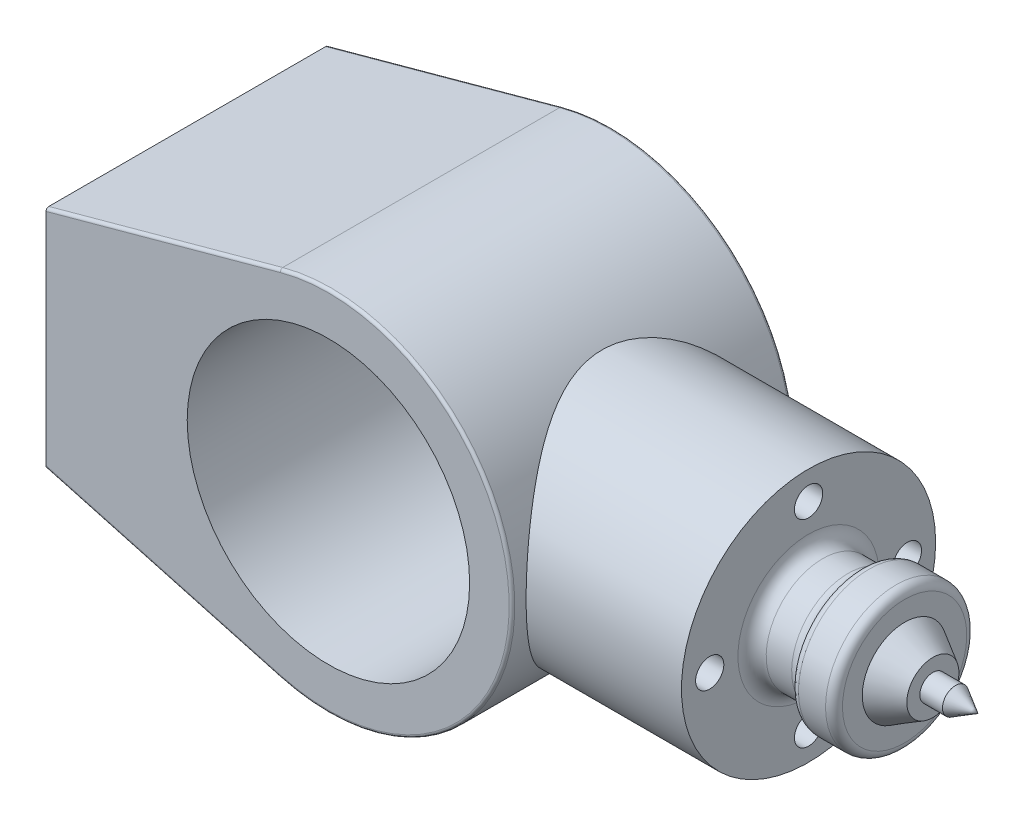
ISO-10303-21;
HEADER;
FILE_DESCRIPTION(('STEP AP214'),'2;1');
FILE_NAME('part.step','',(''),(''),'','','');
FILE_SCHEMA(('AUTOMOTIVE_DESIGN { 1 0 10303 214 1 1 1 1 }'));
ENDSEC;
DATA;
#1=APPLICATION_CONTEXT('core data for automotive mechanical design processes');
#2=APPLICATION_PROTOCOL_DEFINITION('international standard','automotive_design',2000,#1);
#3=PRODUCT_CONTEXT('',#1,'mechanical');
#4=PRODUCT('Part','Part','',(#3));
#5=PRODUCT_RELATED_PRODUCT_CATEGORY('part','',(#4));
#6=PRODUCT_DEFINITION_FORMATION('','',#4);
#7=PRODUCT_DEFINITION_CONTEXT('part definition',#1,'design');
#8=PRODUCT_DEFINITION('design','',#6,#7);
#9=PRODUCT_DEFINITION_SHAPE('','',#8);
#10=(LENGTH_UNIT() NAMED_UNIT(*) SI_UNIT(.MILLI.,.METRE.));
#11=(NAMED_UNIT(*) PLANE_ANGLE_UNIT() SI_UNIT($,.RADIAN.));
#12=(NAMED_UNIT(*) SI_UNIT($,.STERADIAN.) SOLID_ANGLE_UNIT());
#13=UNCERTAINTY_MEASURE_WITH_UNIT(LENGTH_MEASURE(1.E-05),#10,'distance_accuracy_value','');
#14=(GEOMETRIC_REPRESENTATION_CONTEXT(3) GLOBAL_UNCERTAINTY_ASSIGNED_CONTEXT((#13)) GLOBAL_UNIT_ASSIGNED_CONTEXT((#10,
#11,#12)) REPRESENTATION_CONTEXT('',''));
#15=CARTESIAN_POINT('',(0.,0.,0.));
#16=DIRECTION('',(0.,0.,1.));
#17=DIRECTION('',(1.,0.,0.));
#18=AXIS2_PLACEMENT_3D('',#15,#16,#17);
#19=CARTESIAN_POINT('',(0.,0.,50.));
#20=DIRECTION('',(0.,0.,1.));
#21=DIRECTION('',(1.,0.,0.));
#22=AXIS2_PLACEMENT_3D('',#19,#20,#21);
#23=PLANE('',#22);
#24=DIRECTION('',(0.,-1.,0.));
#25=VECTOR('',#24,1.);
#26=CARTESIAN_POINT('',(-100.,-40.,50.));
#27=LINE('',#26,#25);
#28=CARTESIAN_POINT('',(-100.,38.9631546288037,50.));
#29=VERTEX_POINT('',#28);
#30=CARTESIAN_POINT('',(-100.,-38.9631546288037,50.));
#31=VERTEX_POINT('',#30);
#32=EDGE_CURVE('E350',#29,#31,#27,.T.);
#33=ORIENTED_EDGE('',*,*,#32,.T.);
#34=DIRECTION('',(0.964463967125762,-0.264214413149695,0.));
#35=VECTOR('',#34,1.);
#36=CARTESIAN_POINT('',(-16.9097224415805,-61.7256938960487,50.));
#37=LINE('',#36,#35);
#38=CARTESIAN_POINT('',(-16.9097224415805,-61.7256938960487,50.));
#39=VERTEX_POINT('',#38);
#40=EDGE_CURVE('E422',#31,#39,#37,.T.);
#41=ORIENTED_EDGE('',*,*,#40,.T.);
#42=CARTESIAN_POINT('',(0.,0.,50.));
#43=DIRECTION('',(0.,0.,1.));
#44=DIRECTION('',(1.,0.,0.));
#45=AXIS2_PLACEMENT_3D('',#42,#43,#44);
#46=CIRCLE('',#45,64.);
#47=CARTESIAN_POINT('',(-16.9097224415805,61.7256938960487,50.));
#48=VERTEX_POINT('',#47);
#49=EDGE_CURVE('E69',#39,#48,#46,.T.);
#50=ORIENTED_EDGE('',*,*,#49,.T.);
#51=DIRECTION('',(-0.964463967125762,-0.264214413149695,0.));
#52=VECTOR('',#51,1.);
#53=CARTESIAN_POINT('',(-99.7357855868503,39.0355360328742,50.));
#54=LINE('',#53,#52);
#55=EDGE_CURVE('E417',#48,#29,#54,.T.);
#56=ORIENTED_EDGE('',*,*,#55,.T.);
#57=EDGE_LOOP('',(#33,#41,#50,#56));
#58=FACE_BOUND('',#57,.T.);
#59=CARTESIAN_POINT('',(0.,0.,50.));
#60=DIRECTION('',(0.,0.,1.));
#61=DIRECTION('',(1.,0.,0.));
#62=AXIS2_PLACEMENT_3D('',#59,#60,#61);
#63=CIRCLE('',#62,50.);
#64=CARTESIAN_POINT('',(50.,0.,50.));
#65=VERTEX_POINT('',#64);
#66=EDGE_CURVE('E342',#65,#65,#63,.T.);
#67=ORIENTED_EDGE('',*,*,#66,.F.);
#68=EDGE_LOOP('',(#67));
#69=FACE_BOUND('',#68,.T.);
#70=ADVANCED_FACE('F46',(#58,#69),#23,.T.);
#71=CARTESIAN_POINT('',(0.,0.,-50.));
#72=DIRECTION('',(0.,0.,1.));
#73=DIRECTION('',(1.,0.,0.));
#74=AXIS2_PLACEMENT_3D('',#71,#72,#73);
#75=PLANE('',#74);
#76=CARTESIAN_POINT('',(0.,0.,-50.));
#77=DIRECTION('',(0.,0.,1.));
#78=DIRECTION('',(1.,0.,0.));
#79=AXIS2_PLACEMENT_3D('',#76,#77,#78);
#80=CIRCLE('',#79,64.);
#81=CARTESIAN_POINT('',(-16.9097224415805,61.7256938960487,-50.));
#82=VERTEX_POINT('',#81);
#83=CARTESIAN_POINT('',(-16.9097224415805,-61.7256938960487,-50.));
#84=VERTEX_POINT('',#83);
#85=EDGE_CURVE('E393',#82,#84,#80,.F.);
#86=ORIENTED_EDGE('',*,*,#85,.T.);
#87=DIRECTION('',(0.964463967125762,-0.264214413149695,0.));
#88=VECTOR('',#87,1.);
#89=CARTESIAN_POINT('',(-16.9097224415805,-61.7256938960487,-50.));
#90=LINE('',#89,#88);
#91=CARTESIAN_POINT('',(-100.,-38.9631546288037,-50.));
#92=VERTEX_POINT('',#91);
#93=EDGE_CURVE('E396',#84,#92,#90,.F.);
#94=ORIENTED_EDGE('',*,*,#93,.T.);
#95=DIRECTION('',(0.,-1.,0.));
#96=VECTOR('',#95,1.);
#97=CARTESIAN_POINT('',(-100.,-40.,-50.));
#98=LINE('',#97,#96);
#99=CARTESIAN_POINT('',(-100.,38.9631546288037,-50.));
#100=VERTEX_POINT('',#99);
#101=EDGE_CURVE('E348',#100,#92,#98,.T.);
#102=ORIENTED_EDGE('',*,*,#101,.F.);
#103=DIRECTION('',(-0.964463967125762,-0.264214413149695,0.));
#104=VECTOR('',#103,1.);
#105=CARTESIAN_POINT('',(-16.9097224415805,61.7256938960487,-50.));
#106=LINE('',#105,#104);
#107=EDGE_CURVE('E390',#100,#82,#106,.F.);
#108=ORIENTED_EDGE('',*,*,#107,.T.);
#109=EDGE_LOOP('',(#86,#94,#102,#108));
#110=FACE_BOUND('',#109,.T.);
#111=CARTESIAN_POINT('',(0.,0.,-50.));
#112=DIRECTION('',(0.,0.,1.));
#113=DIRECTION('',(1.,0.,0.));
#114=AXIS2_PLACEMENT_3D('',#111,#112,#113);
#115=CIRCLE('',#114,50.);
#116=CARTESIAN_POINT('',(50.,0.,-50.));
#117=VERTEX_POINT('',#116);
#118=EDGE_CURVE('E339',#117,#117,#115,.T.);
#119=ORIENTED_EDGE('',*,*,#118,.T.);
#120=EDGE_LOOP('',(#119));
#121=FACE_BOUND('',#120,.T.);
#122=ADVANCED_FACE('F164',(#110,#121),#75,.F.);
#123=CARTESIAN_POINT('',(-100.,-40.,50.));
#124=DIRECTION('',(0.264214413149695,0.964463967125762,0.));
#125=DIRECTION('',(-0.964463967125762,0.264214413149695,0.));
#126=AXIS2_PLACEMENT_3D('',#123,#124,#125);
#127=PLANE('',#126);
#128=DIRECTION('',(0.,0.,-1.));
#129=VECTOR('',#128,1.);
#130=CARTESIAN_POINT('',(-100.,-40.,50.));
#131=LINE('',#130,#129);
#132=CARTESIAN_POINT('',(-100.,-40.,49.));
#133=VERTEX_POINT('',#132);
#134=CARTESIAN_POINT('',(-100.,-40.,-49.));
#135=VERTEX_POINT('',#134);
#136=EDGE_CURVE('E353',#133,#135,#131,.T.);
#137=ORIENTED_EDGE('',*,*,#136,.T.);
#138=DIRECTION('',(0.964463967125762,-0.264214413149695,0.));
#139=VECTOR('',#138,1.);
#140=CARTESIAN_POINT('',(-100.,-40.,-49.));
#141=LINE('',#140,#139);
#142=CARTESIAN_POINT('',(-17.1739368547302,-62.6901578631745,-49.));
#143=VERTEX_POINT('',#142);
#144=EDGE_CURVE('E386',#135,#143,#141,.T.);
#145=ORIENTED_EDGE('',*,*,#144,.T.);
#146=DIRECTION('',(0.,0.,-1.));
#147=VECTOR('',#146,1.);
#148=CARTESIAN_POINT('',(-17.1739368547302,-62.6901578631745,50.));
#149=LINE('',#148,#147);
#150=CARTESIAN_POINT('',(-17.1739368547302,-62.6901578631745,49.));
#151=VERTEX_POINT('',#150);
#152=EDGE_CURVE('E368',#151,#143,#149,.T.);
#153=ORIENTED_EDGE('',*,*,#152,.F.);
#154=DIRECTION('',(0.964463967125762,-0.264214413149695,0.));
#155=VECTOR('',#154,1.);
#156=CARTESIAN_POINT('',(-100.,-40.,49.));
#157=LINE('',#156,#155);
#158=EDGE_CURVE('E383',#151,#133,#157,.F.);
#159=ORIENTED_EDGE('',*,*,#158,.T.);
#160=EDGE_LOOP('',(#137,#145,#153,#159));
#161=FACE_BOUND('',#160,.T.);
#162=ADVANCED_FACE('F169',(#161),#127,.F.);
#163=CARTESIAN_POINT('',(0.,0.,50.));
#164=DIRECTION('',(0.,0.,-1.));
#165=DIRECTION('',(-1.,0.,0.));
#166=AXIS2_PLACEMENT_3D('',#163,#164,#165);
#167=CYLINDRICAL_SURFACE('',#166,65.);
#168=CARTESIAN_POINT('',(65.,0.,-45.));
#169=CARTESIAN_POINT('',(65.0000011696056,1.12147330120565,-45.0000012025283));
#170=CARTESIAN_POINT('',(64.9709159765212,2.24292945230778,-44.9580201602482));
#171=CARTESIAN_POINT('',(64.8553068641382,4.47658414079082,-44.790785609369));
#172=CARTESIAN_POINT('',(64.7687842573088,5.58878288911931,-44.6655340035371));
#173=CARTESIAN_POINT('',(64.5403785763001,7.79555151848628,-44.3336771879691));
#174=CARTESIAN_POINT('',(64.3984760503455,8.89011506447751,-44.1270433931238));
#175=CARTESIAN_POINT('',(64.0626457436965,11.0533096019768,-43.6354760134034));
#176=CARTESIAN_POINT('',(63.8687169569864,12.1219400915896,-43.3505409144375));
#177=CARTESIAN_POINT('',(63.4342222744662,14.2212125160505,-42.7078017297046));
#178=CARTESIAN_POINT('',(63.1938918545644,15.2520162370063,-42.3503651251477));
#179=CARTESIAN_POINT('',(62.6709259446923,17.2756280115286,-41.5659763086892));
#180=CARTESIAN_POINT('',(62.3882907364914,18.268436318107,-41.1390245597888));
#181=CARTESIAN_POINT('',(61.786108553932,20.2116697228795,-40.2199419970838));
#182=CARTESIAN_POINT('',(61.4665619062631,21.1620951960855,-39.7278117601444));
#183=CARTESIAN_POINT('',(60.7962171584065,23.0172309124315,-38.6825647509799));
#184=CARTESIAN_POINT('',(60.4454175300333,23.9219389167185,-38.1294449962195));
#185=CARTESIAN_POINT('',(59.6865648974473,25.7601880140228,-36.9151737617935));
#186=CARTESIAN_POINT('',(59.2761881540199,26.6893215363404,-36.2488040005491));
#187=CARTESIAN_POINT('',(58.4330275057249,28.4880338622967,-34.8529502059224));
#188=CARTESIAN_POINT('',(58.0002425478181,29.3576098626539,-34.1234632053608));
#189=CARTESIAN_POINT('',(57.1195111836477,31.0364486388513,-32.6040251352403));
#190=CARTESIAN_POINT('',(56.671544718189,31.8456267033451,-31.8139921794123));
#191=CARTESIAN_POINT('',(55.7691986061138,33.4006700551814,-30.1773036556993));
#192=CARTESIAN_POINT('',(55.3148185876118,34.1465316534289,-29.3306447936721));
#193=CARTESIAN_POINT('',(54.3303114345594,35.6959084068904,-27.4326466159468));
#194=CARTESIAN_POINT('',(53.8005937511268,36.4872853280241,-26.3711450656526));
#195=CARTESIAN_POINT('',(52.7593327891933,37.9773509509911,-24.17604025639));
#196=CARTESIAN_POINT('',(52.2477941160226,38.6760162868262,-23.0424189272517));
#197=CARTESIAN_POINT('',(51.2608149265043,39.9749077721744,-20.7072341856928));
#198=CARTESIAN_POINT('',(50.7853275075272,40.5752630453964,-19.5057627267967));
#199=CARTESIAN_POINT('',(49.8892399163792,41.6721166930025,-17.036931864064));
#200=CARTESIAN_POINT('',(49.4686114171658,42.1686687478853,-15.7696069409943));
#201=CARTESIAN_POINT('',(48.8208029416878,42.9149535309565,-13.5723996352816));
#202=CARTESIAN_POINT('',(48.5738420263557,43.1936925213245,-12.6581208440976));
#203=CARTESIAN_POINT('',(48.1238801744123,43.6944569649788,-10.8035389223551));
#204=CARTESIAN_POINT('',(47.9208721021929,43.9164916250901,-9.86324004407419));
#205=CARTESIAN_POINT('',(47.5660754926547,44.3005296261305,-7.96250438663409));
#206=CARTESIAN_POINT('',(47.4142038087044,44.4626304606427,-7.00210302149487));
#207=CARTESIAN_POINT('',(47.1671263845176,44.7246555122386,-5.06554052628518));
#208=CARTESIAN_POINT('',(47.0719206259529,44.824579749433,-4.08937940131225));
#209=CARTESIAN_POINT('',(46.9418899090943,44.9607388198673,-2.12323648479672));
#210=CARTESIAN_POINT('',(46.9073939345416,44.9966266570423,-1.1332085184466));
#211=CARTESIAN_POINT('',(46.9013571135476,45.0029190462422,0.847248377093819));
#212=CARTESIAN_POINT('',(46.9298161498631,44.9733237202183,1.83767730553397));
#213=CARTESIAN_POINT('',(47.048430284982,44.8492190899201,3.81128752429078));
#214=CARTESIAN_POINT('',(47.13862305521,44.7546701492421,4.79446401850659));
#215=CARTESIAN_POINT('',(47.3768313176078,44.5024241630868,6.74551496467453));
#216=CARTESIAN_POINT('',(47.5248480621437,44.3447257499009,7.71338908473165));
#217=CARTESIAN_POINT('',(47.862176427184,43.9803320764262,9.56919366964681));
#218=CARTESIAN_POINT('',(48.0484149088863,43.7772163066585,10.4583970625519));
#219=CARTESIAN_POINT('',(48.4609441046405,43.32010640119,12.2144143492181));
#220=CARTESIAN_POINT('',(48.6872496045114,43.0660934784815,13.0812198417582));
#221=CARTESIAN_POINT('',(49.1738509640382,42.5096331932465,14.7898225666926));
#222=CARTESIAN_POINT('',(49.4341648638833,42.2071601049959,15.6316062329481));
#223=CARTESIAN_POINT('',(49.9825182796334,41.5563350032135,17.2876417419012));
#224=CARTESIAN_POINT('',(50.2705534011696,41.2079902580444,18.1018979206948));
#225=CARTESIAN_POINT('',(51.0225431471344,40.2767822129268,20.1137766396802));
#226=CARTESIAN_POINT('',(51.5007434523328,39.6654891440573,21.2930273345177));
#227=CARTESIAN_POINT('',(52.4891158781476,38.3480299208521,23.5833678403921));
#228=CARTESIAN_POINT('',(52.9993005340588,37.6418264436727,24.6944305853524));
#229=CARTESIAN_POINT('',(54.0361557973493,36.1376496350166,26.8476775780094));
#230=CARTESIAN_POINT('',(54.562853578546,35.339518562356,27.889738450571));
#231=CARTESIAN_POINT('',(55.6171804467177,33.6558443419671,29.8998791095632));
#232=CARTESIAN_POINT('',(56.1448094104417,32.7703120184234,30.8679680307498));
#233=CARTESIAN_POINT('',(57.1932449701134,30.9045304086319,32.7363921475658));
#234=CARTESIAN_POINT('',(57.7139191350982,29.9233731295192,33.6358963165067));
#235=CARTESIAN_POINT('',(58.7296419536464,27.8771206485979,35.350355349792));
#236=CARTESIAN_POINT('',(59.224688270066,26.8120178135979,36.1653025097018));
#237=CARTESIAN_POINT('',(60.1756566955638,24.6035209522421,37.7024332048813));
#238=CARTESIAN_POINT('',(60.6316475651595,23.4602711709794,38.4247809320632));
#239=CARTESIAN_POINT('',(61.493189160821,21.0989507187335,39.7703323765769));
#240=CARTESIAN_POINT('',(61.8987550178729,19.8809026570889,40.3935658507715));
#241=CARTESIAN_POINT('',(62.5646802947782,17.6549035875763,41.4059204565395));
#242=CARTESIAN_POINT('',(62.8372982548466,16.6602403417734,41.8163120535009));
#243=CARTESIAN_POINT('',(63.3397164077327,14.6345031625145,42.5675669112335));
#244=CARTESIAN_POINT('',(63.569522535998,13.603434299959,42.9084398107234));
#245=CARTESIAN_POINT('',(63.9815049902596,11.5110112910017,43.5164676119118));
#246=CARTESIAN_POINT('',(64.1637052650743,10.4496726714622,43.7836595836378));
#247=CARTESIAN_POINT('',(64.476639865795,8.30296993183375,44.2409869387356));
#248=CARTESIAN_POINT('',(64.6073730982256,7.21760530180257,44.431120684921));
#249=CARTESIAN_POINT('',(64.8147345736682,5.02649787175026,44.7321113931982));
#250=CARTESIAN_POINT('',(64.8911534961693,3.92069290489765,44.8426616714377));
#251=CARTESIAN_POINT('',(64.9872183357685,1.70145350776209,44.981563734156));
#252=CARTESIAN_POINT('',(65.0068642771873,0.588019080747705,45.0099155538474));
#253=CARTESIAN_POINT('',(64.9889001241944,-1.63741781931564,44.9839662509349));
#254=CARTESIAN_POINT('',(64.9512898349751,-2.74942028747965,44.929664847113));
#255=CARTESIAN_POINT('',(64.8197344180529,-4.962989473676,44.7392747901952));
#256=CARTESIAN_POINT('',(64.7257910494465,-6.06455651648124,44.6031886909653));
#257=CARTESIAN_POINT('',(64.4911757033089,-8.18254449212146,44.2620157992034));
#258=CARTESIAN_POINT('',(64.3536808680178,-9.20007959997771,44.0616107864454));
#259=CARTESIAN_POINT('',(64.0337856060907,-11.2121337136588,43.593061351668));
#260=CARTESIAN_POINT('',(63.8513873855499,-12.2066538475799,43.3249202574929));
#261=CARTESIAN_POINT('',(63.4451725249075,-14.1673074608522,42.7239854011605));
#262=CARTESIAN_POINT('',(63.2213525684631,-15.1334386601222,42.3911864622048));
#263=CARTESIAN_POINT('',(62.736336352677,-17.0327019487273,41.6643868113869));
#264=CARTESIAN_POINT('',(62.4751380044848,-17.965832190203,41.2703826790343));
#265=CARTESIAN_POINT('',(61.8990085085122,-19.8637431772395,40.3931275129008));
#266=CARTESIAN_POINT('',(61.58152095285,-20.8256806929253,39.9054081529014));
#267=CARTESIAN_POINT('',(60.9142086391395,-22.7035764997345,38.8677076181211));
#268=CARTESIAN_POINT('',(60.5643826081083,-23.6195329786528,38.3177239921568));
#269=CARTESIAN_POINT('',(59.83813471294,-25.4032558353403,37.1592008079418));
#270=CARTESIAN_POINT('',(59.4616987975441,-26.270996314329,36.5506302507532));
#271=CARTESIAN_POINT('',(58.6884577670335,-27.9557544991496,35.2787474176625));
#272=CARTESIAN_POINT('',(58.2916515549571,-28.7727694681138,34.615432192531));
#273=CARTESIAN_POINT('',(57.4151711853793,-30.4889708749911,33.1199200847162));
#274=CARTESIAN_POINT('',(56.9328754552547,-31.3785212006928,32.2781812569548));
#275=CARTESIAN_POINT('',(55.9590893109093,-33.0839042215169,30.527835244559));
#276=CARTESIAN_POINT('',(55.4675975421249,-33.8997259516807,29.61921815009));
#277=CARTESIAN_POINT('',(54.4860350387396,-35.45586994741,27.7375714933993));
#278=CARTESIAN_POINT('',(53.9959654596117,-36.1961418986443,26.7644997080007));
#279=CARTESIAN_POINT('',(53.0294834997435,-37.5978502361011,24.7568233036382));
#280=CARTESIAN_POINT('',(52.553069328415,-38.2592969946585,23.7222268074148));
#281=CARTESIAN_POINT('',(51.679941347726,-39.4291013564639,21.7149007388747));
#282=CARTESIAN_POINT('',(51.2803372484815,-39.9463152685162,20.7485884228094));
#283=CARTESIAN_POINT('',(50.5123974548911,-40.9130636661729,18.7705314851885));
#284=CARTESIAN_POINT('',(50.1440619804653,-41.3625976757848,17.7587865441704));
#285=CARTESIAN_POINT('',(49.4504928922364,-42.1893301292689,15.693797265063));
#286=CARTESIAN_POINT('',(49.1251906412472,-42.566644202947,14.6406225749502));
#287=CARTESIAN_POINT('',(48.5290098021011,-43.2451098617227,12.4950157035289));
#288=CARTESIAN_POINT('',(48.2581179989952,-43.5462799449171,11.4025931307278));
#289=CARTESIAN_POINT('',(47.8271610412375,-44.018687486118,9.39216299943513));
#290=CARTESIAN_POINT('',(47.6558419905218,-44.2036946073207,8.47979353570421));
#291=CARTESIAN_POINT('',(47.3627606953031,-44.517583244497,6.63757582668248));
#292=CARTESIAN_POINT('',(47.2409923142223,-44.6464717105955,5.70772976070377));
#293=CARTESIAN_POINT('',(47.0516661570499,-44.8459556683364,3.83718735816975));
#294=CARTESIAN_POINT('',(46.9840561376508,-44.9166073394188,2.89650236820518));
#295=CARTESIAN_POINT('',(46.9055698265681,-44.9985645522097,1.01014116515039));
#296=CARTESIAN_POINT('',(46.894694331428,-45.0098692606967,0.064464882169828));
#297=CARTESIAN_POINT('',(46.9301408777118,-44.972908524549,-1.82506201386801));
#298=CARTESIAN_POINT('',(46.9764888551695,-44.9246160680299,-2.76891160474199));
#299=CARTESIAN_POINT('',(47.1245232303033,-44.7693052695385,-4.6473189128986));
#300=CARTESIAN_POINT('',(47.2262092962439,-44.6622872796082,-5.58187668584872));
#301=CARTESIAN_POINT('',(47.4811423262628,-44.3911660407895,-7.43666598606559));
#302=CARTESIAN_POINT('',(47.6344529193939,-44.2269923369625,-8.35687836049677));
#303=CARTESIAN_POINT('',(47.9871889035597,-43.8440109221367,-10.1768310643422));
#304=CARTESIAN_POINT('',(48.1866204648688,-43.6251959006593,-11.0765686368372));
#305=CARTESIAN_POINT('',(48.6908782922366,-43.0625185245671,-13.1167261780629));
#306=CARTESIAN_POINT('',(49.0093972350599,-42.7008255731353,-14.2488681052182));
#307=CARTESIAN_POINT('',(49.6995544941609,-41.8955268796886,-16.4668795226372));
#308=CARTESIAN_POINT('',(50.0712093704162,-41.4518955887103,-17.5527344499461));
#309=CARTESIAN_POINT('',(50.8544123719762,-40.4872212981013,-19.6760329984318));
#310=CARTESIAN_POINT('',(51.2660067549032,-39.9660881554129,-20.7134183727637));
#311=CARTESIAN_POINT('',(52.1162118793059,-38.8508952329156,-22.7363587217864));
#312=CARTESIAN_POINT('',(52.5548209260534,-38.2568400254561,-23.7219169406071));
#313=CARTESIAN_POINT('',(53.4579357785501,-36.9847423381264,-25.6613286822633));
#314=CARTESIAN_POINT('',(53.922802110137,-36.3051118639051,-26.6139712103077));
#315=CARTESIAN_POINT('',(54.8583333343945,-34.8753950985048,-28.461753284073));
#316=CARTESIAN_POINT('',(55.3289982185487,-34.1253089107937,-29.3568929142367));
#317=CARTESIAN_POINT('',(56.2664339133502,-32.5564691651912,-31.0876310121466));
#318=CARTESIAN_POINT('',(56.7332035093429,-31.7376950080829,-31.923211478402));
#319=CARTESIAN_POINT('',(57.6535165855434,-30.033481652025,-33.5315189390535));
#320=CARTESIAN_POINT('',(58.1070588196761,-29.1480362003112,-34.3042400240121));
#321=CARTESIAN_POINT('',(59.0635284336243,-27.1643113596246,-35.9022819462666));
#322=CARTESIAN_POINT('',(59.5626106290918,-26.054747286961,-36.7159606163356));
#323=CARTESIAN_POINT('',(60.5176757229356,-23.7521280348398,-38.245864136929));
#324=CARTESIAN_POINT('',(60.9736519283073,-22.5590599397198,-38.962073861155));
#325=CARTESIAN_POINT('',(61.6149926579413,-20.7127348127312,-39.9558623322098));
#326=CARTESIAN_POINT('',(61.8215919655178,-20.0881105839991,-40.2735888165197));
#327=CARTESIAN_POINT('',(62.2191547005856,-18.8206694867557,-40.8812436548858));
#328=CARTESIAN_POINT('',(62.4101203779565,-18.1778552539997,-41.1711760099034));
#329=CARTESIAN_POINT('',(62.7748527233683,-16.875283117665,-41.7219931318356));
#330=CARTESIAN_POINT('',(62.9486230408551,-16.2155288469422,-41.9828840638124));
#331=CARTESIAN_POINT('',(63.2775356475736,-14.8804011558234,-42.4744610119282));
#332=CARTESIAN_POINT('',(63.4326792844209,-14.2050288695918,-42.7051492133045));
#333=CARTESIAN_POINT('',(63.80707219681,-12.4447010544916,-43.25974494481));
#334=CARTESIAN_POINT('',(64.0114184468013,-11.3490405228655,-43.5602757498286));
#335=CARTESIAN_POINT('',(64.3654191982087,-9.12991345978808,-44.078827644396));
#336=CARTESIAN_POINT('',(64.5150820049425,-8.00645117856261,-44.2968612637911));
#337=CARTESIAN_POINT('',(64.7559993187061,-5.74082253729114,-44.6470112993716));
#338=CARTESIAN_POINT('',(64.847297757104,-4.59867091062174,-44.7791923387443));
#339=CARTESIAN_POINT('',(64.9692976296881,-2.30434018473196,-44.9556862638234));
#340=CARTESIAN_POINT('',(64.9999987983895,-1.15216104160189,-44.999998764566));
#341=CARTESIAN_POINT('',(65.,0.,-45.));
#342=B_SPLINE_CURVE_WITH_KNOTS('',3,(#168,#169,#170,#171,#172,#173,#174,#175,#176,#177,#178,
#179,#180,#181,#182,#183,#184,#185,#186,#187,#188,#189,#190,#191,#192,#193,#194,#195,#196,#197,
#198,#199,#200,#201,#202,#203,#204,#205,#206,#207,#208,#209,#210,#211,#212,#213,#214,#215,#216,
#217,#218,#219,#220,#221,#222,#223,#224,#225,#226,#227,#228,#229,#230,#231,#232,#233,#234,#235,
#236,#237,#238,#239,#240,#241,#242,#243,#244,#245,#246,#247,#248,#249,#250,#251,#252,#253,#254,
#255,#256,#257,#258,#259,#260,#261,#262,#263,#264,#265,#266,#267,#268,#269,#270,#271,#272,#273,
#274,#275,#276,#277,#278,#279,#280,#281,#282,#283,#284,#285,#286,#287,#288,#289,#290,#291,#292,
#293,#294,#295,#296,#297,#298,#299,#300,#301,#302,#303,#304,#305,#306,#307,#308,#309,#310,#311,
#312,#313,#314,#315,#316,#317,#318,#319,#320,#321,#322,#323,#324,#325,#326,#327,#328,#329,#330,
#331,#332,#333,#334,#335,#336,#337,#338,#339,#340,#341),.UNSPECIFIED.,.T.,.F.,(4,2,2,2,2,2,2,2,
2,2,2,2,2,2,2,2,2,2,2,2,2,2,2,2,2,2,2,2,2,2,2,2,2,2,2,2,2,2,2,2,2,2,2,2,2,2,2,2,2,2,2,2,2,2,2,2,
2,2,2,2,2,2,2,2,2,2,2,2,2,2,2,2,2,2,2,2,2,2,2,2,2,2,2,2,2,2,4),(0.,3.36323892794144,
6.72640100710137,10.0907454360665,13.4551549250109,16.8029195613731,20.1506619010729,
23.4983746134034,26.8462511096753,30.4871649037346,34.1282499524345,37.7743494260164,
41.4206611917409,45.6939383064405,49.9682903731881,54.2369825353392,58.5034617073672,
61.4625138492405,64.4210852373372,67.3748225577202,70.3285589227264,73.2982527376573,
76.2679410220407,79.2394430998938,82.2110095388412,85.0011411726389,87.7923045951578,
90.584954683776,93.3771628083065,97.6064034875675,101.837312178738,106.075592113262,
110.313347816192,114.596218662803,118.879479402292,123.155037051935,127.429308626693,
130.755998382163,134.082226580387,137.406778235214,140.731400520075,144.068767009318,
147.406132068879,150.743508483461,154.080780688207,157.215791533369,160.350648386749,
163.485756334407,166.621039552604,169.990545063149,173.360183268584,176.73161428665,
180.103227050672,184.047902440152,187.993163521895,191.94103513809,195.888386692538,
199.385185586645,202.88200907258,206.373186157811,209.863514294626,212.700365177753,
215.536864625513,218.370624567028,221.204424293963,224.039508887241,226.874576485218,
229.713151272815,232.55210603787,236.23803941247,239.925124033801,243.616531168718,
247.307706963636,251.081871120678,254.856029735251,258.631324277359,262.406973327354,
266.792058434817,271.177823293658,273.368885604935,275.55963203795,277.749912517597,
279.940034437727,283.398420446896,286.856280978073,290.31153567335,293.766805506531),.UNSPECIFIED.);
#343=CARTESIAN_POINT('',(65.,0.,-45.));
#344=VERTEX_POINT('',#343);
#345=EDGE_CURVE('E127',#344,#344,#342,.T.);
#346=ORIENTED_EDGE('',*,*,#345,.F.);
#347=EDGE_LOOP('',(#346));
#348=FACE_BOUND('',#347,.T.);
#349=ORIENTED_EDGE('',*,*,#152,.T.);
#350=CARTESIAN_POINT('',(0.,0.,-49.));
#351=DIRECTION('',(0.,0.,1.));
#352=DIRECTION('',(1.,0.,0.));
#353=AXIS2_PLACEMENT_3D('',#350,#351,#352);
#354=CIRCLE('',#353,65.);
#355=CARTESIAN_POINT('',(-17.1739368547302,62.6901578631745,-49.));
#356=VERTEX_POINT('',#355);
#357=EDGE_CURVE('E414',#143,#356,#354,.T.);
#358=ORIENTED_EDGE('',*,*,#357,.T.);
#359=DIRECTION('',(0.,0.,-1.));
#360=VECTOR('',#359,1.);
#361=CARTESIAN_POINT('',(-17.1739368547302,62.6901578631745,50.));
#362=LINE('',#361,#360);
#363=CARTESIAN_POINT('',(-17.1739368547302,62.6901578631745,49.));
#364=VERTEX_POINT('',#363);
#365=EDGE_CURVE('E364',#364,#356,#362,.T.);
#366=ORIENTED_EDGE('',*,*,#365,.F.);
#367=CARTESIAN_POINT('',(0.,0.,49.));
#368=DIRECTION('',(0.,0.,1.));
#369=DIRECTION('',(1.,0.,0.));
#370=AXIS2_PLACEMENT_3D('',#367,#368,#369);
#371=CIRCLE('',#370,65.);
#372=EDGE_CURVE('E411',#364,#151,#371,.F.);
#373=ORIENTED_EDGE('',*,*,#372,.T.);
#374=EDGE_LOOP('',(#349,#358,#366,#373));
#375=FACE_BOUND('',#374,.T.);
#376=ADVANCED_FACE('F181',(#348,#375),#167,.T.);
#377=CARTESIAN_POINT('',(-100.,40.,50.));
#378=DIRECTION('',(0.264214413149695,-0.964463967125762,0.));
#379=DIRECTION('',(0.964463967125762,0.264214413149695,0.));
#380=AXIS2_PLACEMENT_3D('',#377,#378,#379);
#381=PLANE('',#380);
#382=ORIENTED_EDGE('',*,*,#365,.T.);
#383=DIRECTION('',(-0.964463967125762,-0.264214413149695,0.));
#384=VECTOR('',#383,1.);
#385=CARTESIAN_POINT('',(-100.,40.,-49.));
#386=LINE('',#385,#384);
#387=CARTESIAN_POINT('',(-100.,40.,-49.));
#388=VERTEX_POINT('',#387);
#389=EDGE_CURVE('E235',#356,#388,#386,.T.);
#390=ORIENTED_EDGE('',*,*,#389,.T.);
#391=DIRECTION('',(0.,0.,-1.));
#392=VECTOR('',#391,1.);
#393=CARTESIAN_POINT('',(-100.,40.,50.));
#394=LINE('',#393,#392);
#395=CARTESIAN_POINT('',(-100.,40.,49.));
#396=VERTEX_POINT('',#395);
#397=EDGE_CURVE('E360',#396,#388,#394,.T.);
#398=ORIENTED_EDGE('',*,*,#397,.F.);
#399=DIRECTION('',(-0.964463967125762,-0.264214413149695,0.));
#400=VECTOR('',#399,1.);
#401=CARTESIAN_POINT('',(-17.1739368547302,62.6901578631745,49.));
#402=LINE('',#401,#400);
#403=EDGE_CURVE('E241',#396,#364,#402,.F.);
#404=ORIENTED_EDGE('',*,*,#403,.T.);
#405=EDGE_LOOP('',(#382,#390,#398,#404));
#406=FACE_BOUND('',#405,.T.);
#407=ADVANCED_FACE('F177',(#406),#381,.F.);
#408=CARTESIAN_POINT('',(-100.,-40.,50.));
#409=DIRECTION('',(1.,0.,0.));
#410=DIRECTION('',(0.,1.,0.));
#411=AXIS2_PLACEMENT_3D('',#408,#409,#410);
#412=PLANE('',#411);
#413=ORIENTED_EDGE('',*,*,#101,.T.);
#414=CARTESIAN_POINT('',(-100.,-38.9631546288037,-49.));
#415=DIRECTION('',(1.,0.,0.));
#416=DIRECTION('',(0.,-1.,0.));
#417=AXIS2_PLACEMENT_3D('',#414,#415,#416);
#418=ELLIPSE('',#417,1.03684537119633,1.);
#419=EDGE_CURVE('E408',#92,#135,#418,.F.);
#420=ORIENTED_EDGE('',*,*,#419,.T.);
#421=ORIENTED_EDGE('',*,*,#136,.F.);
#422=CARTESIAN_POINT('',(-100.,-38.9631546288037,49.));
#423=DIRECTION('',(1.,0.,0.));
#424=DIRECTION('',(0.,1.,0.));
#425=AXIS2_PLACEMENT_3D('',#422,#423,#424);
#426=ELLIPSE('',#425,1.03684537119633,1.);
#427=EDGE_CURVE('E405',#133,#31,#426,.F.);
#428=ORIENTED_EDGE('',*,*,#427,.T.);
#429=ORIENTED_EDGE('',*,*,#32,.F.);
#430=CARTESIAN_POINT('',(-100.,38.9631546288037,49.));
#431=DIRECTION('',(1.,0.,0.));
#432=DIRECTION('',(0.,1.,0.));
#433=AXIS2_PLACEMENT_3D('',#430,#431,#432);
#434=ELLIPSE('',#433,1.03684537119633,1.);
#435=EDGE_CURVE('E399',#29,#396,#434,.F.);
#436=ORIENTED_EDGE('',*,*,#435,.T.);
#437=ORIENTED_EDGE('',*,*,#397,.T.);
#438=CARTESIAN_POINT('',(-100.,38.9631546288037,-49.));
#439=DIRECTION('',(1.,0.,0.));
#440=DIRECTION('',(0.,-1.,0.));
#441=AXIS2_PLACEMENT_3D('',#438,#439,#440);
#442=ELLIPSE('',#441,1.03684537119633,1.);
#443=EDGE_CURVE('E402',#388,#100,#442,.F.);
#444=ORIENTED_EDGE('',*,*,#443,.T.);
#445=EDGE_LOOP('',(#413,#420,#421,#428,#429,#436,#437,#444));
#446=FACE_BOUND('',#445,.T.);
#447=ADVANCED_FACE('F161',(#446),#412,.F.);
#448=CARTESIAN_POINT('',(0.,0.,50.));
#449=DIRECTION('',(0.,0.,-1.));
#450=DIRECTION('',(-1.,0.,0.));
#451=AXIS2_PLACEMENT_3D('',#448,#449,#450);
#452=CYLINDRICAL_SURFACE('',#451,50.);
#453=ORIENTED_EDGE('',*,*,#66,.T.);
#454=EDGE_LOOP('',(#453));
#455=FACE_BOUND('',#454,.T.);
#456=ORIENTED_EDGE('',*,*,#118,.F.);
#457=EDGE_LOOP('',(#456));
#458=FACE_BOUND('',#457,.T.);
#459=ADVANCED_FACE('F153',(#455,#458),#452,.F.);
#460=CARTESIAN_POINT('',(-100.002,0.,0.));
#461=DIRECTION('',(1.,0.,0.));
#462=DIRECTION('',(0.,0.,-1.));
#463=AXIS2_PLACEMENT_3D('',#460,#461,#462);
#464=CYLINDRICAL_SURFACE('',#463,45.);
#465=CARTESIAN_POINT('',(120.,0.,0.));
#466=DIRECTION('',(1.,0.,0.));
#467=DIRECTION('',(0.,0.,-1.));
#468=AXIS2_PLACEMENT_3D('',#465,#466,#467);
#469=CIRCLE('',#468,45.);
#470=CARTESIAN_POINT('',(120.,0.,-45.));
#471=VERTEX_POINT('',#470);
#472=EDGE_CURVE('E133',#471,#471,#469,.T.);
#473=ORIENTED_EDGE('',*,*,#472,.F.);
#474=EDGE_LOOP('',(#473));
#475=FACE_BOUND('',#474,.T.);
#476=ORIENTED_EDGE('',*,*,#345,.T.);
#477=EDGE_LOOP('',(#476));
#478=FACE_BOUND('',#477,.T.);
#479=ADVANCED_FACE('F121',(#475,#478),#464,.T.);
#480=CARTESIAN_POINT('',(120.,0.,0.));
#481=DIRECTION('',(1.,0.,0.));
#482=DIRECTION('',(0.,0.,-1.));
#483=AXIS2_PLACEMENT_3D('',#480,#481,#482);
#484=PLANE('',#483);
#485=CARTESIAN_POINT('',(120.,0.,0.));
#486=DIRECTION('',(1.,0.,0.));
#487=DIRECTION('',(0.,0.,-1.));
#488=AXIS2_PLACEMENT_3D('',#485,#486,#487);
#489=CIRCLE('',#488,25.);
#490=CARTESIAN_POINT('',(120.,0.,-25.));
#491=VERTEX_POINT('',#490);
#492=EDGE_CURVE('E380',#491,#491,#489,.F.);
#493=ORIENTED_EDGE('',*,*,#492,.T.);
#494=EDGE_LOOP('',(#493));
#495=FACE_BOUND('',#494,.T.);
#496=CARTESIAN_POINT('',(120.,35.,0.));
#497=DIRECTION('',(1.,0.,0.));
#498=DIRECTION('',(0.,0.,-1.));
#499=AXIS2_PLACEMENT_3D('',#496,#497,#498);
#500=CIRCLE('',#499,5.);
#501=CARTESIAN_POINT('',(120.,35.,-5.));
#502=VERTEX_POINT('',#501);
#503=EDGE_CURVE('E314',#502,#502,#500,.T.);
#504=ORIENTED_EDGE('',*,*,#503,.F.);
#505=EDGE_LOOP('',(#504));
#506=FACE_BOUND('',#505,.T.);
#507=CARTESIAN_POINT('',(120.,0.,-35.));
#508=DIRECTION('',(1.,0.,0.));
#509=DIRECTION('',(0.,0.,-1.));
#510=AXIS2_PLACEMENT_3D('',#507,#508,#509);
#511=CIRCLE('',#510,5.00000000000012);
#512=CARTESIAN_POINT('',(120.,0.,-40.0000000000001));
#513=VERTEX_POINT('',#512);
#514=EDGE_CURVE('E310',#513,#513,#511,.T.);
#515=ORIENTED_EDGE('',*,*,#514,.F.);
#516=EDGE_LOOP('',(#515));
#517=FACE_BOUND('',#516,.T.);
#518=CARTESIAN_POINT('',(120.,-35.,0.));
#519=DIRECTION('',(1.,0.,0.));
#520=DIRECTION('',(0.,0.,-1.));
#521=AXIS2_PLACEMENT_3D('',#518,#519,#520);
#522=CIRCLE('',#521,5.00000000000023);
#523=CARTESIAN_POINT('',(120.,-35.,-5.00000000000022));
#524=VERTEX_POINT('',#523);
#525=EDGE_CURVE('E302',#524,#524,#522,.T.);
#526=ORIENTED_EDGE('',*,*,#525,.F.);
#527=EDGE_LOOP('',(#526));
#528=FACE_BOUND('',#527,.T.);
#529=CARTESIAN_POINT('',(120.,0.,35.));
#530=DIRECTION('',(1.,0.,0.));
#531=DIRECTION('',(0.,0.,-1.));
#532=AXIS2_PLACEMENT_3D('',#529,#530,#531);
#533=CIRCLE('',#532,5.00000000000035);
#534=CARTESIAN_POINT('',(120.,0.,29.9999999999997));
#535=VERTEX_POINT('',#534);
#536=EDGE_CURVE('E293',#535,#535,#533,.T.);
#537=ORIENTED_EDGE('',*,*,#536,.F.);
#538=EDGE_LOOP('',(#537));
#539=FACE_BOUND('',#538,.T.);
#540=ORIENTED_EDGE('',*,*,#472,.T.);
#541=EDGE_LOOP('',(#540));
#542=FACE_BOUND('',#541,.T.);
#543=ADVANCED_FACE('F119',(#495,#506,#517,#528,#539,#542),#484,.T.);
#544=CARTESIAN_POINT('',(172.019237886467,0.,0.));
#545=DIRECTION('',(-1.,0.,0.));
#546=DIRECTION('',(0.,-1.,0.));
#547=AXIS2_PLACEMENT_3D('',#544,#545,#546);
#548=CONICAL_SURFACE('',#547,4.60769515458676,0.523598775598294);
#549=CARTESIAN_POINT('',(180.,0.,0.));
#550=VERTEX_POINT('',#549);
#551=VERTEX_LOOP('',#550);
#552=FACE_BOUND('',#551,.T.);
#553=CARTESIAN_POINT('',(172.019237886467,0.,0.));
#554=DIRECTION('',(-1.,0.,0.));
#555=DIRECTION('',(0.,-1.,0.));
#556=AXIS2_PLACEMENT_3D('',#553,#554,#555);
#557=CIRCLE('',#556,4.60769515458676);
#558=CARTESIAN_POINT('',(172.019237886467,-4.60769515458678,0.));
#559=VERTEX_POINT('',#558);
#560=EDGE_CURVE('E124',#559,#559,#557,.T.);
#561=ORIENTED_EDGE('',*,*,#560,.F.);
#562=EDGE_LOOP('',(#561));
#563=FACE_BOUND('',#562,.T.);
#564=ADVANCED_FACE('F115',(#552,#563),#548,.T.);
#565=CARTESIAN_POINT('',(0.,0.,0.));
#566=DIRECTION('',(-1.,0.,0.));
#567=DIRECTION('',(0.,-1.,0.));
#568=AXIS2_PLACEMENT_3D('',#565,#566,#567);
#569=CYLINDRICAL_SURFACE('',#568,4.60769515458676);
#570=ORIENTED_EDGE('',*,*,#560,.T.);
#571=EDGE_LOOP('',(#570));
#572=FACE_BOUND('',#571,.T.);
#573=CARTESIAN_POINT('',(164.019237886467,0.,0.));
#574=DIRECTION('',(-1.,0.,0.));
#575=DIRECTION('',(0.,-1.,0.));
#576=AXIS2_PLACEMENT_3D('',#573,#574,#575);
#577=CIRCLE('',#576,4.60769515458675);
#578=CARTESIAN_POINT('',(164.019237886467,-4.60769515458677,0.));
#579=VERTEX_POINT('',#578);
#580=EDGE_CURVE('E128',#579,#579,#577,.T.);
#581=ORIENTED_EDGE('',*,*,#580,.F.);
#582=EDGE_LOOP('',(#581));
#583=FACE_BOUND('',#582,.T.);
#584=ADVANCED_FACE('F118',(#572,#583),#569,.T.);
#585=CARTESIAN_POINT('',(164.019237886467,-4.60769515458677,0.));
#586=DIRECTION('',(1.,0.,0.));
#587=DIRECTION('',(0.,1.,0.));
#588=AXIS2_PLACEMENT_3D('',#585,#586,#587);
#589=PLANE('',#588);
#590=ORIENTED_EDGE('',*,*,#580,.T.);
#591=EDGE_LOOP('',(#590));
#592=FACE_BOUND('',#591,.T.);
#593=CARTESIAN_POINT('',(164.019237886467,0.,0.));
#594=DIRECTION('',(-1.,0.,0.));
#595=DIRECTION('',(0.,-1.,0.));
#596=AXIS2_PLACEMENT_3D('',#593,#594,#595);
#597=CIRCLE('',#596,9.22649730810375);
#598=CARTESIAN_POINT('',(164.019237886467,-9.22649730810377,0.));
#599=VERTEX_POINT('',#598);
#600=EDGE_CURVE('E136',#599,#599,#597,.T.);
#601=ORIENTED_EDGE('',*,*,#600,.F.);
#602=EDGE_LOOP('',(#601));
#603=FACE_BOUND('',#602,.T.);
#604=ADVANCED_FACE('F270',(#592,#603),#589,.T.);
#605=CARTESIAN_POINT('',(154.019237886467,0.,0.));
#606=DIRECTION('',(-1.,0.,0.));
#607=DIRECTION('',(0.,-1.,0.));
#608=AXIS2_PLACEMENT_3D('',#605,#606,#607);
#609=CONICAL_SURFACE('',#608,15.,0.523598775598297);
#610=ORIENTED_EDGE('',*,*,#600,.T.);
#611=EDGE_LOOP('',(#610));
#612=FACE_BOUND('',#611,.T.);
#613=CARTESIAN_POINT('',(154.019237886467,0.,0.));
#614=DIRECTION('',(-1.,0.,0.));
#615=DIRECTION('',(0.,-1.,0.));
#616=AXIS2_PLACEMENT_3D('',#613,#614,#615);
#617=CIRCLE('',#616,15.);
#618=CARTESIAN_POINT('',(154.019237886467,-15.,0.));
#619=VERTEX_POINT('',#618);
#620=EDGE_CURVE('E283',#619,#619,#617,.T.);
#621=ORIENTED_EDGE('',*,*,#620,.F.);
#622=EDGE_LOOP('',(#621));
#623=FACE_BOUND('',#622,.T.);
#624=ADVANCED_FACE('F263',(#612,#623),#609,.T.);
#625=CARTESIAN_POINT('',(154.019237886467,-15.,0.));
#626=DIRECTION('',(1.,0.,0.));
#627=DIRECTION('',(0.,1.,0.));
#628=AXIS2_PLACEMENT_3D('',#625,#626,#627);
#629=PLANE('',#628);
#630=CARTESIAN_POINT('',(154.019237886467,0.,0.));
#631=DIRECTION('',(1.,0.,0.));
#632=DIRECTION('',(0.,1.,0.));
#633=AXIS2_PLACEMENT_3D('',#630,#631,#632);
#634=CIRCLE('',#633,22.);
#635=CARTESIAN_POINT('',(154.019237886467,22.,0.));
#636=VERTEX_POINT('',#635);
#637=EDGE_CURVE('E11',#636,#636,#634,.T.);
#638=ORIENTED_EDGE('',*,*,#637,.T.);
#639=EDGE_LOOP('',(#638));
#640=FACE_BOUND('',#639,.T.);
#641=ORIENTED_EDGE('',*,*,#620,.T.);
#642=EDGE_LOOP('',(#641));
#643=FACE_BOUND('',#642,.T.);
#644=ADVANCED_FACE('F252',(#640,#643),#629,.T.);
#645=CARTESIAN_POINT('',(0.,0.,0.));
#646=DIRECTION('',(-1.,0.,0.));
#647=DIRECTION('',(0.,-1.,0.));
#648=AXIS2_PLACEMENT_3D('',#645,#646,#647);
#649=CYLINDRICAL_SURFACE('',#648,25.);
#650=CARTESIAN_POINT('',(141.435436373562,0.,0.));
#651=DIRECTION('',(1.,0.,0.));
#652=DIRECTION('',(0.,1.,0.));
#653=AXIS2_PLACEMENT_3D('',#650,#651,#652);
#654=CIRCLE('',#653,25.);
#655=CARTESIAN_POINT('',(141.435436373562,25.,0.));
#656=VERTEX_POINT('',#655);
#657=EDGE_CURVE('E55',#656,#656,#654,.T.);
#658=ORIENTED_EDGE('',*,*,#657,.T.);
#659=EDGE_LOOP('',(#658));
#660=FACE_BOUND('',#659,.T.);
#661=CARTESIAN_POINT('',(151.019237886467,0.,0.));
#662=DIRECTION('',(1.,0.,0.));
#663=DIRECTION('',(0.,1.,0.));
#664=AXIS2_PLACEMENT_3D('',#661,#662,#663);
#665=CIRCLE('',#664,25.);
#666=CARTESIAN_POINT('',(151.019237886467,25.,0.));
#667=VERTEX_POINT('',#666);
#668=EDGE_CURVE('E234',#667,#667,#665,.F.);
#669=ORIENTED_EDGE('',*,*,#668,.T.);
#670=EDGE_LOOP('',(#669));
#671=FACE_BOUND('',#670,.T.);
#672=ADVANCED_FACE('F248',(#660,#671),#649,.T.);
#673=CARTESIAN_POINT('',(0.,0.,0.));
#674=DIRECTION('',(-1.,0.,0.));
#675=DIRECTION('',(0.,-1.,0.));
#676=AXIS2_PLACEMENT_3D('',#673,#674,#675);
#677=CYLINDRICAL_SURFACE('',#676,20.);
#678=CARTESIAN_POINT('',(134.019237886467,0.,0.));
#679=DIRECTION('',(-1.,0.,0.));
#680=DIRECTION('',(0.,-1.,0.));
#681=AXIS2_PLACEMENT_3D('',#678,#679,#680);
#682=CIRCLE('',#681,20.);
#683=CARTESIAN_POINT('',(134.019237886467,-20.,0.));
#684=VERTEX_POINT('',#683);
#685=EDGE_CURVE('E376',#684,#684,#682,.T.);
#686=ORIENTED_EDGE('',*,*,#685,.T.);
#687=EDGE_LOOP('',(#686));
#688=FACE_BOUND('',#687,.T.);
#689=CARTESIAN_POINT('',(125.,0.,0.));
#690=DIRECTION('',(1.,0.,0.));
#691=DIRECTION('',(0.,0.,-1.));
#692=AXIS2_PLACEMENT_3D('',#689,#690,#691);
#693=CIRCLE('',#692,20.);
#694=CARTESIAN_POINT('',(125.,0.,-20.));
#695=VERTEX_POINT('',#694);
#696=EDGE_CURVE('E372',#695,#695,#693,.T.);
#697=ORIENTED_EDGE('',*,*,#696,.T.);
#698=EDGE_LOOP('',(#697));
#699=FACE_BOUND('',#698,.T.);
#700=ADVANCED_FACE('F251',(#688,#699),#677,.T.);
#701=CARTESIAN_POINT('',(100.,0.,35.));
#702=DIRECTION('',(1.,0.,0.));
#703=DIRECTION('',(0.,0.,-1.));
#704=AXIS2_PLACEMENT_3D('',#701,#702,#703);
#705=CYLINDRICAL_SURFACE('',#704,5.00000000000035);
#706=CARTESIAN_POINT('',(100.,0.,35.));
#707=DIRECTION('',(1.,0.,0.));
#708=DIRECTION('',(0.,0.,-1.));
#709=AXIS2_PLACEMENT_3D('',#706,#707,#708);
#710=CIRCLE('',#709,5.00000000000035);
#711=CARTESIAN_POINT('',(100.,0.,29.9999999999997));
#712=VERTEX_POINT('',#711);
#713=EDGE_CURVE('E289',#712,#712,#710,.T.);
#714=ORIENTED_EDGE('',*,*,#713,.F.);
#715=EDGE_LOOP('',(#714));
#716=FACE_BOUND('',#715,.T.);
#717=ORIENTED_EDGE('',*,*,#536,.T.);
#718=EDGE_LOOP('',(#717));
#719=FACE_BOUND('',#718,.T.);
#720=ADVANCED_FACE('F260',(#716,#719),#705,.F.);
#721=CARTESIAN_POINT('',(100.,0.,35.));
#722=DIRECTION('',(1.,0.,0.));
#723=DIRECTION('',(0.,0.,-1.));
#724=AXIS2_PLACEMENT_3D('',#721,#722,#723);
#725=PLANE('',#724);
#726=ORIENTED_EDGE('',*,*,#713,.T.);
#727=EDGE_LOOP('',(#726));
#728=FACE_BOUND('',#727,.T.);
#729=ADVANCED_FACE('F469',(#728),#725,.T.);
#730=CARTESIAN_POINT('',(100.,-35.,0.));
#731=DIRECTION('',(1.,0.,0.));
#732=DIRECTION('',(0.,0.,-1.));
#733=AXIS2_PLACEMENT_3D('',#730,#731,#732);
#734=CYLINDRICAL_SURFACE('',#733,5.00000000000023);
#735=CARTESIAN_POINT('',(100.,-35.,0.));
#736=DIRECTION('',(1.,0.,0.));
#737=DIRECTION('',(0.,0.,-1.));
#738=AXIS2_PLACEMENT_3D('',#735,#736,#737);
#739=CIRCLE('',#738,5.00000000000023);
#740=CARTESIAN_POINT('',(100.,-35.,-5.00000000000022));
#741=VERTEX_POINT('',#740);
#742=EDGE_CURVE('E298',#741,#741,#739,.T.);
#743=ORIENTED_EDGE('',*,*,#742,.F.);
#744=EDGE_LOOP('',(#743));
#745=FACE_BOUND('',#744,.T.);
#746=ORIENTED_EDGE('',*,*,#525,.T.);
#747=EDGE_LOOP('',(#746));
#748=FACE_BOUND('',#747,.T.);
#749=ADVANCED_FACE('F475',(#745,#748),#734,.F.);
#750=CARTESIAN_POINT('',(100.,-35.,0.));
#751=DIRECTION('',(1.,0.,0.));
#752=DIRECTION('',(0.,0.,-1.));
#753=AXIS2_PLACEMENT_3D('',#750,#751,#752);
#754=PLANE('',#753);
#755=ORIENTED_EDGE('',*,*,#742,.T.);
#756=EDGE_LOOP('',(#755));
#757=FACE_BOUND('',#756,.T.);
#758=ADVANCED_FACE('F479',(#757),#754,.T.);
#759=CARTESIAN_POINT('',(100.,0.,-35.));
#760=DIRECTION('',(1.,0.,0.));
#761=DIRECTION('',(0.,0.,-1.));
#762=AXIS2_PLACEMENT_3D('',#759,#760,#761);
#763=CYLINDRICAL_SURFACE('',#762,5.00000000000012);
#764=CARTESIAN_POINT('',(100.,0.,-35.));
#765=DIRECTION('',(1.,0.,0.));
#766=DIRECTION('',(0.,0.,-1.));
#767=AXIS2_PLACEMENT_3D('',#764,#765,#766);
#768=CIRCLE('',#767,5.00000000000012);
#769=CARTESIAN_POINT('',(100.,0.,-40.0000000000001));
#770=VERTEX_POINT('',#769);
#771=EDGE_CURVE('E306',#770,#770,#768,.T.);
#772=ORIENTED_EDGE('',*,*,#771,.F.);
#773=EDGE_LOOP('',(#772));
#774=FACE_BOUND('',#773,.T.);
#775=ORIENTED_EDGE('',*,*,#514,.T.);
#776=EDGE_LOOP('',(#775));
#777=FACE_BOUND('',#776,.T.);
#778=ADVANCED_FACE('F482',(#774,#777),#763,.F.);
#779=CARTESIAN_POINT('',(100.,0.,-35.));
#780=DIRECTION('',(1.,0.,0.));
#781=DIRECTION('',(0.,0.,-1.));
#782=AXIS2_PLACEMENT_3D('',#779,#780,#781);
#783=PLANE('',#782);
#784=ORIENTED_EDGE('',*,*,#771,.T.);
#785=EDGE_LOOP('',(#784));
#786=FACE_BOUND('',#785,.T.);
#787=ADVANCED_FACE('F326',(#786),#783,.T.);
#788=CARTESIAN_POINT('',(100.,35.,0.));
#789=DIRECTION('',(1.,0.,0.));
#790=DIRECTION('',(0.,0.,-1.));
#791=AXIS2_PLACEMENT_3D('',#788,#789,#790);
#792=CYLINDRICAL_SURFACE('',#791,5.);
#793=CARTESIAN_POINT('',(100.,35.,0.));
#794=DIRECTION('',(1.,0.,0.));
#795=DIRECTION('',(0.,0.,-1.));
#796=AXIS2_PLACEMENT_3D('',#793,#794,#795);
#797=CIRCLE('',#796,5.);
#798=CARTESIAN_POINT('',(100.,35.,-5.));
#799=VERTEX_POINT('',#798);
#800=EDGE_CURVE('E286',#799,#799,#797,.T.);
#801=ORIENTED_EDGE('',*,*,#800,.F.);
#802=EDGE_LOOP('',(#801));
#803=FACE_BOUND('',#802,.T.);
#804=ORIENTED_EDGE('',*,*,#503,.T.);
#805=EDGE_LOOP('',(#804));
#806=FACE_BOUND('',#805,.T.);
#807=ADVANCED_FACE('F323',(#803,#806),#792,.F.);
#808=CARTESIAN_POINT('',(100.,35.,0.));
#809=DIRECTION('',(1.,0.,0.));
#810=DIRECTION('',(0.,0.,-1.));
#811=AXIS2_PLACEMENT_3D('',#808,#809,#810);
#812=PLANE('',#811);
#813=ORIENTED_EDGE('',*,*,#800,.T.);
#814=EDGE_LOOP('',(#813));
#815=FACE_BOUND('',#814,.T.);
#816=ADVANCED_FACE('F193',(#815),#812,.T.);
#817=CARTESIAN_POINT('',(134.019237886467,0.,0.));
#818=DIRECTION('',(-1.,0.,0.));
#819=DIRECTION('',(0.,-1.,0.));
#820=AXIS2_PLACEMENT_3D('',#817,#818,#819);
#821=TOROIDAL_SURFACE('',#820,25.,5.);
#822=CARTESIAN_POINT('',(138.654361940902,0.,0.));
#823=DIRECTION('',(-1.,0.,0.));
#824=DIRECTION('',(0.,-1.,0.));
#825=AXIS2_PLACEMENT_3D('',#822,#823,#824);
#826=CIRCLE('',#825,23.125);
#827=CARTESIAN_POINT('',(138.654361940902,-23.125,0.));
#828=VERTEX_POINT('',#827);
#829=EDGE_CURVE('E232',#828,#828,#826,.T.);
#830=ORIENTED_EDGE('',*,*,#829,.T.);
#831=EDGE_LOOP('',(#830));
#832=FACE_BOUND('',#831,.T.);
#833=ORIENTED_EDGE('',*,*,#685,.F.);
#834=EDGE_LOOP('',(#833));
#835=FACE_BOUND('',#834,.T.);
#836=ADVANCED_FACE('F189',(#832,#835),#821,.F.);
#837=CARTESIAN_POINT('',(125.,0.,0.));
#838=DIRECTION('',(1.,0.,0.));
#839=DIRECTION('',(0.,0.,-1.));
#840=AXIS2_PLACEMENT_3D('',#837,#838,#839);
#841=TOROIDAL_SURFACE('',#840,25.,5.);
#842=ORIENTED_EDGE('',*,*,#696,.F.);
#843=EDGE_LOOP('',(#842));
#844=FACE_BOUND('',#843,.T.);
#845=ORIENTED_EDGE('',*,*,#492,.F.);
#846=EDGE_LOOP('',(#845));
#847=FACE_BOUND('',#846,.T.);
#848=ADVANCED_FACE('F192',(#844,#847),#841,.F.);
#849=CARTESIAN_POINT('',(-99.7357855868503,39.0355360328742,-49.));
#850=DIRECTION('',(-0.964463967125762,-0.264214413149695,0.));
#851=DIRECTION('',(0.264214413149695,-0.964463967125762,0.));
#852=AXIS2_PLACEMENT_3D('',#849,#850,#851);
#853=CYLINDRICAL_SURFACE('',#852,1.);
#854=ORIENTED_EDGE('',*,*,#443,.F.);
#855=ORIENTED_EDGE('',*,*,#389,.F.);
#856=CARTESIAN_POINT('',(-16.9097224415805,61.7256938960487,-49.));
#857=DIRECTION('',(0.964463967125762,0.264214413149694,0.));
#858=DIRECTION('',(-0.264214413149694,0.964463967125762,0.));
#859=AXIS2_PLACEMENT_3D('',#856,#857,#858);
#860=CIRCLE('',#859,1.);
#861=EDGE_CURVE('E294',#82,#356,#860,.T.);
#862=ORIENTED_EDGE('',*,*,#861,.F.);
#863=ORIENTED_EDGE('',*,*,#107,.F.);
#864=EDGE_LOOP('',(#854,#855,#862,#863));
#865=FACE_BOUND('',#864,.T.);
#866=ADVANCED_FACE('F197',(#865),#853,.T.);
#867=CARTESIAN_POINT('',(0.,0.,-49.));
#868=DIRECTION('',(0.,0.,1.));
#869=DIRECTION('',(1.,0.,0.));
#870=AXIS2_PLACEMENT_3D('',#867,#868,#869);
#871=TOROIDAL_SURFACE('',#870,64.,1.);
#872=ORIENTED_EDGE('',*,*,#861,.T.);
#873=ORIENTED_EDGE('',*,*,#357,.F.);
#874=CARTESIAN_POINT('',(-16.9097224415805,-61.7256938960487,-49.));
#875=DIRECTION('',(-0.964463967125762,0.264214413149694,0.));
#876=DIRECTION('',(-0.264214413149694,-0.964463967125762,0.));
#877=AXIS2_PLACEMENT_3D('',#874,#875,#876);
#878=CIRCLE('',#877,1.);
#879=EDGE_CURVE('E427',#84,#143,#878,.T.);
#880=ORIENTED_EDGE('',*,*,#879,.F.);
#881=ORIENTED_EDGE('',*,*,#85,.F.);
#882=EDGE_LOOP('',(#872,#873,#880,#881));
#883=FACE_BOUND('',#882,.T.);
#884=ADVANCED_FACE('F203',(#883),#871,.T.);
#885=CARTESIAN_POINT('',(-99.7357855868503,-39.0355360328743,-49.));
#886=DIRECTION('',(0.964463967125762,-0.264214413149695,0.));
#887=DIRECTION('',(0.264214413149695,0.964463967125762,0.));
#888=AXIS2_PLACEMENT_3D('',#885,#886,#887);
#889=CYLINDRICAL_SURFACE('',#888,1.);
#890=ORIENTED_EDGE('',*,*,#419,.F.);
#891=ORIENTED_EDGE('',*,*,#93,.F.);
#892=ORIENTED_EDGE('',*,*,#879,.T.);
#893=ORIENTED_EDGE('',*,*,#144,.F.);
#894=EDGE_LOOP('',(#890,#891,#892,#893));
#895=FACE_BOUND('',#894,.T.);
#896=ADVANCED_FACE('F199',(#895),#889,.T.);
#897=CARTESIAN_POINT('',(-16.9097224415805,61.7256938960487,49.));
#898=DIRECTION('',(0.964463967125762,0.264214413149695,0.));
#899=DIRECTION('',(-0.264214413149695,0.964463967125762,0.));
#900=AXIS2_PLACEMENT_3D('',#897,#898,#899);
#901=CYLINDRICAL_SURFACE('',#900,1.);
#902=ORIENTED_EDGE('',*,*,#435,.F.);
#903=ORIENTED_EDGE('',*,*,#55,.F.);
#904=CARTESIAN_POINT('',(-16.9097224415805,61.7256938960487,49.));
#905=DIRECTION('',(0.964463967125762,0.264214413149694,0.));
#906=DIRECTION('',(-0.264214413149694,0.964463967125762,0.));
#907=AXIS2_PLACEMENT_3D('',#904,#905,#906);
#908=CIRCLE('',#907,1.);
#909=EDGE_CURVE('E244',#364,#48,#908,.T.);
#910=ORIENTED_EDGE('',*,*,#909,.F.);
#911=ORIENTED_EDGE('',*,*,#403,.F.);
#912=EDGE_LOOP('',(#902,#903,#910,#911));
#913=FACE_BOUND('',#912,.T.);
#914=ADVANCED_FACE('F202',(#913),#901,.T.);
#915=CARTESIAN_POINT('',(0.,0.,49.));
#916=DIRECTION('',(0.,0.,1.));
#917=DIRECTION('',(1.,0.,0.));
#918=AXIS2_PLACEMENT_3D('',#915,#916,#917);
#919=TOROIDAL_SURFACE('',#918,64.,1.);
#920=ORIENTED_EDGE('',*,*,#909,.T.);
#921=ORIENTED_EDGE('',*,*,#49,.F.);
#922=CARTESIAN_POINT('',(-16.9097224415805,-61.7256938960487,49.));
#923=DIRECTION('',(-0.964463967125762,0.264214413149694,0.));
#924=DIRECTION('',(-0.264214413149694,-0.964463967125762,0.));
#925=AXIS2_PLACEMENT_3D('',#922,#923,#924);
#926=CIRCLE('',#925,1.);
#927=EDGE_CURVE('E62',#151,#39,#926,.T.);
#928=ORIENTED_EDGE('',*,*,#927,.F.);
#929=ORIENTED_EDGE('',*,*,#372,.F.);
#930=EDGE_LOOP('',(#920,#921,#928,#929));
#931=FACE_BOUND('',#930,.T.);
#932=ADVANCED_FACE('F215',(#931),#919,.T.);
#933=CARTESIAN_POINT('',(-16.9097224415805,-61.7256938960487,49.));
#934=DIRECTION('',(-0.964463967125762,0.264214413149695,0.));
#935=DIRECTION('',(-0.264214413149695,-0.964463967125762,0.));
#936=AXIS2_PLACEMENT_3D('',#933,#934,#935);
#937=CYLINDRICAL_SURFACE('',#936,1.);
#938=ORIENTED_EDGE('',*,*,#427,.F.);
#939=ORIENTED_EDGE('',*,*,#158,.F.);
#940=ORIENTED_EDGE('',*,*,#927,.T.);
#941=ORIENTED_EDGE('',*,*,#40,.F.);
#942=EDGE_LOOP('',(#938,#939,#940,#941));
#943=FACE_BOUND('',#942,.T.);
#944=ADVANCED_FACE('F211',(#943),#937,.T.);
#945=CARTESIAN_POINT('',(141.435436373562,0.,0.));
#946=DIRECTION('',(1.,0.,0.));
#947=DIRECTION('',(0.,1.,0.));
#948=AXIS2_PLACEMENT_3D('',#945,#946,#947);
#949=TOROIDAL_SURFACE('',#948,22.,3.);
#950=ORIENTED_EDGE('',*,*,#657,.F.);
#951=EDGE_LOOP('',(#950));
#952=FACE_BOUND('',#951,.T.);
#953=ORIENTED_EDGE('',*,*,#829,.F.);
#954=EDGE_LOOP('',(#953));
#955=FACE_BOUND('',#954,.T.);
#956=ADVANCED_FACE('F214',(#952,#955),#949,.T.);
#957=CARTESIAN_POINT('',(151.019237886467,0.,0.));
#958=DIRECTION('',(1.,0.,0.));
#959=DIRECTION('',(0.,1.,0.));
#960=AXIS2_PLACEMENT_3D('',#957,#958,#959);
#961=TOROIDAL_SURFACE('',#960,22.,3.);
#962=ORIENTED_EDGE('',*,*,#637,.F.);
#963=EDGE_LOOP('',(#962));
#964=FACE_BOUND('',#963,.T.);
#965=ORIENTED_EDGE('',*,*,#668,.F.);
#966=EDGE_LOOP('',(#965));
#967=FACE_BOUND('',#966,.T.);
#968=ADVANCED_FACE('F48',(#964,#967),#961,.T.);
#969=CLOSED_SHELL('',(#70,#122,#162,#376,#407,#447,#459,#479,#543,#564,#584,#604,#624,#644,#672,
#700,#720,#729,#749,#758,#778,#787,#807,#816,#836,#848,#866,#884,#896,#914,#932,#944,#956,#968));
#970=MANIFOLD_SOLID_BREP('B2',#969);
#971=ADVANCED_BREP_SHAPE_REPRESENTATION('',(#18,#970),#14);
#972=SHAPE_DEFINITION_REPRESENTATION(#9,#971);
ENDSEC;
END-ISO-10303-21;
